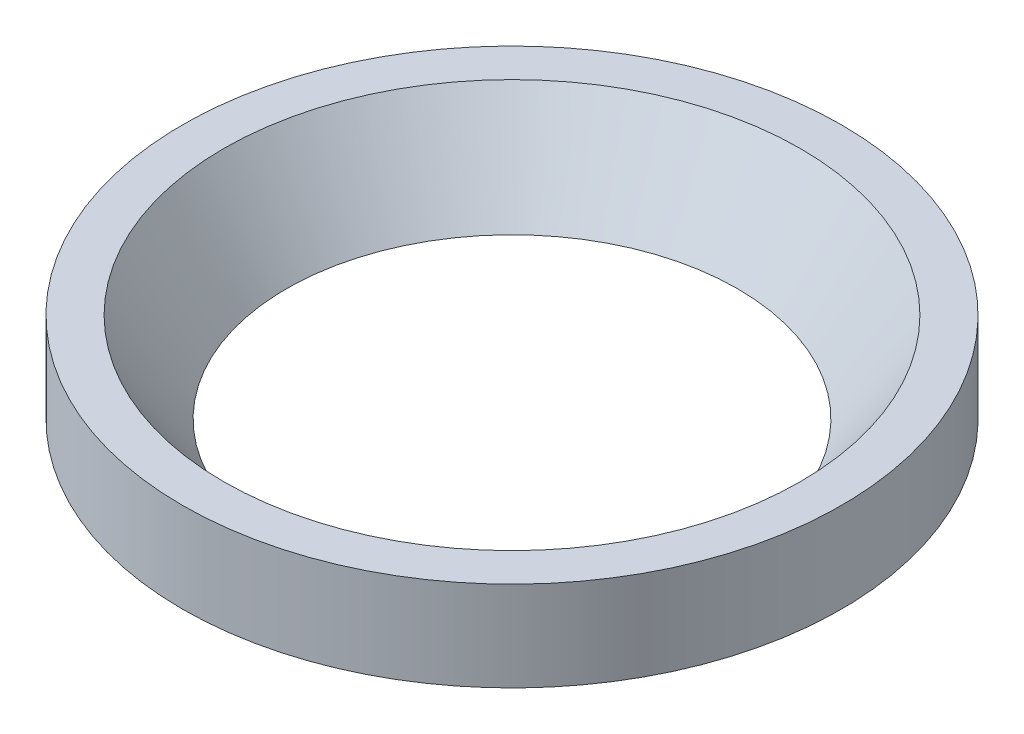
ISO-10303-21;
HEADER;
FILE_DESCRIPTION(('STEP AP214'),'2;1');
FILE_NAME('part.step','',(''),(''),'','','');
FILE_SCHEMA(('AUTOMOTIVE_DESIGN { 1 0 10303 214 1 1 1 1 }'));
ENDSEC;
DATA;
#1=APPLICATION_CONTEXT('core data for automotive mechanical design processes');
#2=APPLICATION_PROTOCOL_DEFINITION('international standard','automotive_design',2000,#1);
#3=PRODUCT_CONTEXT('',#1,'mechanical');
#4=PRODUCT('Part','Part','',(#3));
#5=PRODUCT_RELATED_PRODUCT_CATEGORY('part','',(#4));
#6=PRODUCT_DEFINITION_FORMATION('','',#4);
#7=PRODUCT_DEFINITION_CONTEXT('part definition',#1,'design');
#8=PRODUCT_DEFINITION('design','',#6,#7);
#9=PRODUCT_DEFINITION_SHAPE('','',#8);
#10=(LENGTH_UNIT() NAMED_UNIT(*) SI_UNIT(.MILLI.,.METRE.));
#11=(NAMED_UNIT(*) PLANE_ANGLE_UNIT() SI_UNIT($,.RADIAN.));
#12=(NAMED_UNIT(*) SI_UNIT($,.STERADIAN.) SOLID_ANGLE_UNIT());
#13=UNCERTAINTY_MEASURE_WITH_UNIT(LENGTH_MEASURE(1.E-05),#10,'distance_accuracy_value','');
#14=(GEOMETRIC_REPRESENTATION_CONTEXT(3) GLOBAL_UNCERTAINTY_ASSIGNED_CONTEXT((#13)) GLOBAL_UNIT_ASSIGNED_CONTEXT((#10,
#11,#12)) REPRESENTATION_CONTEXT('',''));
#15=CARTESIAN_POINT('',(0.,0.,0.));
#16=DIRECTION('',(0.,0.,1.));
#17=DIRECTION('',(1.,0.,0.));
#18=AXIS2_PLACEMENT_3D('',#15,#16,#17);
#19=CARTESIAN_POINT('',(0.,-117.74922299812,0.));
#20=DIRECTION('',(0.,-1.,0.));
#21=DIRECTION('',(0.,0.,-1.));
#22=AXIS2_PLACEMENT_3D('',#19,#20,#21);
#23=CYLINDRICAL_SURFACE('',#22,69.85);
#24=CARTESIAN_POINT('',(0.,39.7879841001668,0.));
#25=DIRECTION('',(0.,-1.,0.));
#26=DIRECTION('',(0.,0.,-1.));
#27=AXIS2_PLACEMENT_3D('',#24,#25,#26);
#28=CIRCLE('',#27,69.85);
#29=CARTESIAN_POINT('',(0.,39.7879841001668,-69.85));
#30=VERTEX_POINT('',#29);
#31=EDGE_CURVE('E10',#30,#30,#28,.T.);
#32=ORIENTED_EDGE('',*,*,#31,.F.);
#33=EDGE_LOOP('',(#32));
#34=FACE_BOUND('',#33,.T.);
#35=CARTESIAN_POINT('',(0.,58.8379841001668,0.));
#36=DIRECTION('',(0.,-1.,0.));
#37=DIRECTION('',(0.,0.,-1.));
#38=AXIS2_PLACEMENT_3D('',#35,#36,#37);
#39=CIRCLE('',#38,69.85);
#40=CARTESIAN_POINT('',(0.,58.8379841001668,-69.85));
#41=VERTEX_POINT('',#40);
#42=EDGE_CURVE('E58',#41,#41,#39,.T.);
#43=ORIENTED_EDGE('',*,*,#42,.T.);
#44=EDGE_LOOP('',(#43));
#45=FACE_BOUND('',#44,.T.);
#46=ADVANCED_FACE('F41',(#34,#45),#23,.T.);
#47=CARTESIAN_POINT('',(0.,39.7879841001668,0.));
#48=DIRECTION('',(0.,1.,0.));
#49=DIRECTION('',(0.,0.,1.));
#50=AXIS2_PLACEMENT_3D('',#47,#48,#49);
#51=PLANE('',#50);
#52=CARTESIAN_POINT('',(0.,39.7879841001668,0.));
#53=DIRECTION('',(0.,-1.,0.));
#54=DIRECTION('',(0.,0.,-1.));
#55=AXIS2_PLACEMENT_3D('',#52,#53,#54);
#56=CIRCLE('',#55,47.798846397105);
#57=CARTESIAN_POINT('',(0.,39.7879841001668,-47.798846397105));
#58=VERTEX_POINT('',#57);
#59=EDGE_CURVE('E48',#58,#58,#56,.T.);
#60=ORIENTED_EDGE('',*,*,#59,.F.);
#61=EDGE_LOOP('',(#60));
#62=FACE_BOUND('',#61,.T.);
#63=ORIENTED_EDGE('',*,*,#31,.T.);
#64=EDGE_LOOP('',(#63));
#65=FACE_BOUND('',#64,.T.);
#66=ADVANCED_FACE('F74',(#62,#65),#51,.F.);
#67=CARTESIAN_POINT('',(0.,39.7879841001668,0.));
#68=DIRECTION('',(0.,1.,0.));
#69=DIRECTION('',(0.,0.,1.));
#70=AXIS2_PLACEMENT_3D('',#67,#68,#69);
#71=CONICAL_SURFACE('',#70,47.798846397105,0.610865238198017);
#72=CARTESIAN_POINT('',(0.,58.8379841001669,0.));
#73=DIRECTION('',(0.,-1.,0.));
#74=DIRECTION('',(0.,0.,-1.));
#75=AXIS2_PLACEMENT_3D('',#72,#73,#74);
#76=CIRCLE('',#75,61.1378);
#77=CARTESIAN_POINT('',(0.,58.8379841001669,-61.1378));
#78=VERTEX_POINT('',#77);
#79=EDGE_CURVE('E53',#78,#78,#76,.T.);
#80=ORIENTED_EDGE('',*,*,#79,.F.);
#81=EDGE_LOOP('',(#80));
#82=FACE_BOUND('',#81,.T.);
#83=ORIENTED_EDGE('',*,*,#59,.T.);
#84=EDGE_LOOP('',(#83));
#85=FACE_BOUND('',#84,.T.);
#86=ADVANCED_FACE('F69',(#82,#85),#71,.F.);
#87=CARTESIAN_POINT('',(0.,58.8379841001668,0.));
#88=DIRECTION('',(0.,-1.,0.));
#89=DIRECTION('',(0.,0.,-1.));
#90=AXIS2_PLACEMENT_3D('',#87,#88,#89);
#91=PLANE('',#90);
#92=ORIENTED_EDGE('',*,*,#42,.F.);
#93=EDGE_LOOP('',(#92));
#94=FACE_BOUND('',#93,.T.);
#95=ORIENTED_EDGE('',*,*,#79,.T.);
#96=EDGE_LOOP('',(#95));
#97=FACE_BOUND('',#96,.T.);
#98=ADVANCED_FACE('F66',(#94,#97),#91,.F.);
#99=CLOSED_SHELL('',(#46,#66,#86,#98));
#100=MANIFOLD_SOLID_BREP('B2',#99);
#101=ADVANCED_BREP_SHAPE_REPRESENTATION('',(#18,#100),#14);
#102=SHAPE_DEFINITION_REPRESENTATION(#9,#101);
ENDSEC;
END-ISO-10303-21;
